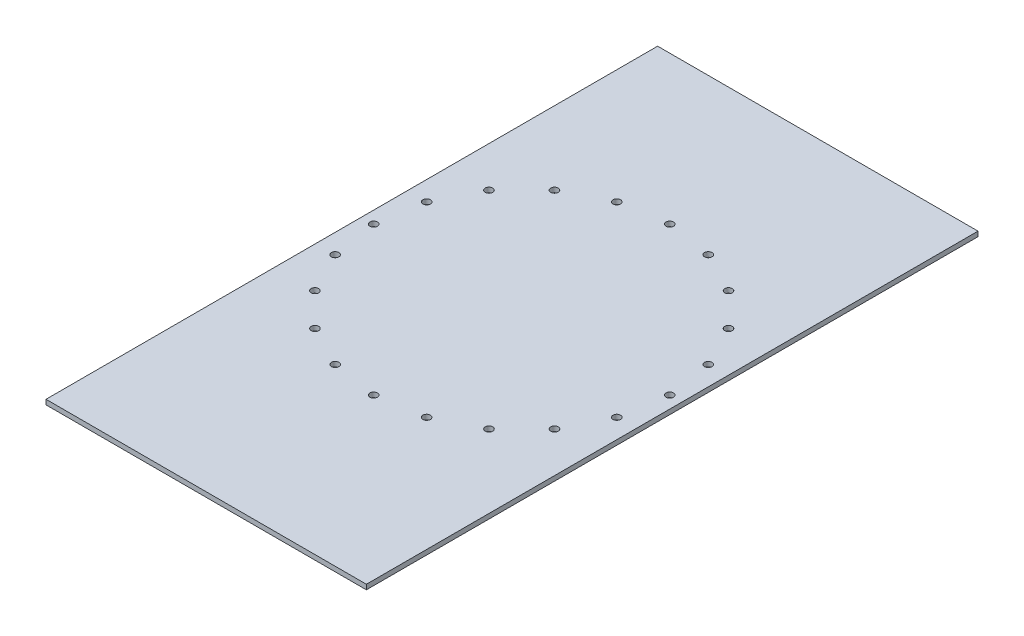
ISO-10303-21;
HEADER;
FILE_DESCRIPTION(('STEP AP214'),'2;1');
FILE_NAME('part.step','',(''),(''),'','','');
FILE_SCHEMA(('AUTOMOTIVE_DESIGN { 1 0 10303 214 1 1 1 1 }'));
ENDSEC;
DATA;
#1=APPLICATION_CONTEXT('core data for automotive mechanical design processes');
#2=APPLICATION_PROTOCOL_DEFINITION('international standard','automotive_design',2000,#1);
#3=PRODUCT_CONTEXT('',#1,'mechanical');
#4=PRODUCT('Part','Part','',(#3));
#5=PRODUCT_RELATED_PRODUCT_CATEGORY('part','',(#4));
#6=PRODUCT_DEFINITION_FORMATION('','',#4);
#7=PRODUCT_DEFINITION_CONTEXT('part definition',#1,'design');
#8=PRODUCT_DEFINITION('design','',#6,#7);
#9=PRODUCT_DEFINITION_SHAPE('','',#8);
#10=(LENGTH_UNIT() NAMED_UNIT(*) SI_UNIT(.MILLI.,.METRE.));
#11=(NAMED_UNIT(*) PLANE_ANGLE_UNIT() SI_UNIT($,.RADIAN.));
#12=(NAMED_UNIT(*) SI_UNIT($,.STERADIAN.) SOLID_ANGLE_UNIT());
#13=UNCERTAINTY_MEASURE_WITH_UNIT(LENGTH_MEASURE(1.E-05),#10,'distance_accuracy_value','');
#14=(GEOMETRIC_REPRESENTATION_CONTEXT(3) GLOBAL_UNCERTAINTY_ASSIGNED_CONTEXT((#13)) GLOBAL_UNIT_ASSIGNED_CONTEXT((#10,
#11,#12)) REPRESENTATION_CONTEXT('',''));
#15=CARTESIAN_POINT('',(0.,0.,0.));
#16=DIRECTION('',(0.,0.,1.));
#17=DIRECTION('',(1.,0.,0.));
#18=AXIS2_PLACEMENT_3D('',#15,#16,#17);
#19=CARTESIAN_POINT('',(0.,10.,0.));
#20=DIRECTION('',(1.,0.,0.));
#21=DIRECTION('',(0.,0.,-1.));
#22=AXIS2_PLACEMENT_3D('',#19,#20,#21);
#23=PLANE('',#22);
#24=DIRECTION('',(0.,0.,1.));
#25=VECTOR('',#24,1.);
#26=CARTESIAN_POINT('',(0.,0.,0.));
#27=LINE('',#26,#25);
#28=CARTESIAN_POINT('',(0.,0.,-1260.));
#29=VERTEX_POINT('',#28);
#30=CARTESIAN_POINT('',(0.,0.,0.));
#31=VERTEX_POINT('',#30);
#32=EDGE_CURVE('E96',#29,#31,#27,.T.);
#33=ORIENTED_EDGE('',*,*,#32,.T.);
#34=DIRECTION('',(0.,-1.,0.));
#35=VECTOR('',#34,1.);
#36=CARTESIAN_POINT('',(0.,10.,0.));
#37=LINE('',#36,#35);
#38=CARTESIAN_POINT('',(0.,10.,0.));
#39=VERTEX_POINT('',#38);
#40=EDGE_CURVE('E11',#39,#31,#37,.T.);
#41=ORIENTED_EDGE('',*,*,#40,.F.);
#42=DIRECTION('',(0.,0.,1.));
#43=VECTOR('',#42,1.);
#44=CARTESIAN_POINT('',(0.,10.,0.));
#45=LINE('',#44,#43);
#46=CARTESIAN_POINT('',(0.,10.,-1260.));
#47=VERTEX_POINT('',#46);
#48=EDGE_CURVE('E84',#47,#39,#45,.T.);
#49=ORIENTED_EDGE('',*,*,#48,.F.);
#50=DIRECTION('',(0.,-1.,0.));
#51=VECTOR('',#50,1.);
#52=CARTESIAN_POINT('',(0.,10.,-1260.));
#53=LINE('',#52,#51);
#54=EDGE_CURVE('E92',#47,#29,#53,.T.);
#55=ORIENTED_EDGE('',*,*,#54,.T.);
#56=EDGE_LOOP('',(#33,#41,#49,#55));
#57=FACE_BOUND('',#56,.T.);
#58=ADVANCED_FACE('F33',(#57),#23,.F.);
#59=CARTESIAN_POINT('',(0.,10.,0.));
#60=DIRECTION('',(0.,0.,-1.));
#61=DIRECTION('',(-1.,0.,0.));
#62=AXIS2_PLACEMENT_3D('',#59,#60,#61);
#63=PLANE('',#62);
#64=DIRECTION('',(1.,0.,0.));
#65=VECTOR('',#64,1.);
#66=CARTESIAN_POINT('',(0.,0.,0.));
#67=LINE('',#66,#65);
#68=CARTESIAN_POINT('',(660.,0.,0.));
#69=VERTEX_POINT('',#68);
#70=EDGE_CURVE('E88',#31,#69,#67,.T.);
#71=ORIENTED_EDGE('',*,*,#70,.T.);
#72=DIRECTION('',(0.,-1.,0.));
#73=VECTOR('',#72,1.);
#74=CARTESIAN_POINT('',(660.,10.,0.));
#75=LINE('',#74,#73);
#76=CARTESIAN_POINT('',(660.,10.,0.));
#77=VERTEX_POINT('',#76);
#78=EDGE_CURVE('E41',#77,#69,#75,.T.);
#79=ORIENTED_EDGE('',*,*,#78,.F.);
#80=DIRECTION('',(1.,0.,0.));
#81=VECTOR('',#80,1.);
#82=CARTESIAN_POINT('',(0.,10.,0.));
#83=LINE('',#82,#81);
#84=EDGE_CURVE('E79',#39,#77,#83,.T.);
#85=ORIENTED_EDGE('',*,*,#84,.F.);
#86=ORIENTED_EDGE('',*,*,#40,.T.);
#87=EDGE_LOOP('',(#71,#79,#85,#86));
#88=FACE_BOUND('',#87,.T.);
#89=ADVANCED_FACE('F87',(#88),#63,.F.);
#90=CARTESIAN_POINT('',(660.,10.,0.));
#91=DIRECTION('',(-1.,0.,0.));
#92=DIRECTION('',(0.,0.,1.));
#93=AXIS2_PLACEMENT_3D('',#90,#91,#92);
#94=PLANE('',#93);
#95=DIRECTION('',(0.,0.,-1.));
#96=VECTOR('',#95,1.);
#97=CARTESIAN_POINT('',(660.,0.,0.));
#98=LINE('',#97,#96);
#99=CARTESIAN_POINT('',(660.,0.,-1260.));
#100=VERTEX_POINT('',#99);
#101=EDGE_CURVE('E66',#69,#100,#98,.T.);
#102=ORIENTED_EDGE('',*,*,#101,.T.);
#103=DIRECTION('',(0.,-1.,0.));
#104=VECTOR('',#103,1.);
#105=CARTESIAN_POINT('',(660.,10.,-1260.));
#106=LINE('',#105,#104);
#107=CARTESIAN_POINT('',(660.,10.,-1260.));
#108=VERTEX_POINT('',#107);
#109=EDGE_CURVE('E89',#108,#100,#106,.T.);
#110=ORIENTED_EDGE('',*,*,#109,.F.);
#111=DIRECTION('',(0.,0.,-1.));
#112=VECTOR('',#111,1.);
#113=CARTESIAN_POINT('',(660.,10.,0.));
#114=LINE('',#113,#112);
#115=EDGE_CURVE('E82',#77,#108,#114,.T.);
#116=ORIENTED_EDGE('',*,*,#115,.F.);
#117=ORIENTED_EDGE('',*,*,#78,.T.);
#118=EDGE_LOOP('',(#102,#110,#116,#117));
#119=FACE_BOUND('',#118,.T.);
#120=ADVANCED_FACE('F90',(#119),#94,.F.);
#121=CARTESIAN_POINT('',(0.,10.,-1260.));
#122=DIRECTION('',(0.,0.,1.));
#123=DIRECTION('',(1.,0.,0.));
#124=AXIS2_PLACEMENT_3D('',#121,#122,#123);
#125=PLANE('',#124);
#126=DIRECTION('',(-1.,0.,0.));
#127=VECTOR('',#126,1.);
#128=CARTESIAN_POINT('',(0.,0.,-1260.));
#129=LINE('',#128,#127);
#130=EDGE_CURVE('E72',#100,#29,#129,.T.);
#131=ORIENTED_EDGE('',*,*,#130,.T.);
#132=ORIENTED_EDGE('',*,*,#54,.F.);
#133=DIRECTION('',(-1.,0.,0.));
#134=VECTOR('',#133,1.);
#135=CARTESIAN_POINT('',(0.,10.,-1260.));
#136=LINE('',#135,#134);
#137=EDGE_CURVE('E49',#108,#47,#136,.T.);
#138=ORIENTED_EDGE('',*,*,#137,.F.);
#139=ORIENTED_EDGE('',*,*,#109,.T.);
#140=EDGE_LOOP('',(#131,#132,#138,#139));
#141=FACE_BOUND('',#140,.T.);
#142=ADVANCED_FACE('F104',(#141),#125,.F.);
#143=CARTESIAN_POINT('',(0.,10.,0.));
#144=DIRECTION('',(0.,-1.,0.));
#145=DIRECTION('',(0.,0.,-1.));
#146=AXIS2_PLACEMENT_3D('',#143,#144,#145);
#147=PLANE('',#146);
#148=CARTESIAN_POINT('',(39.9277625299783,10.,-555.749816715641));
#149=DIRECTION('',(0.,1.,0.));
#150=DIRECTION('',(0.,0.,1.));
#151=AXIS2_PLACEMENT_3D('',#148,#149,#150);
#152=CIRCLE('',#151,7.74999999999992);
#153=CARTESIAN_POINT('',(39.9277625299783,10.,-547.999816715641));
#154=VERTEX_POINT('',#153);
#155=EDGE_CURVE('E224',#154,#154,#152,.T.);
#156=ORIENTED_EDGE('',*,*,#155,.F.);
#157=EDGE_LOOP('',(#156));
#158=FACE_BOUND('',#157,.T.);
#159=CARTESIAN_POINT('',(83.2498167156411,10.,-470.725498050796));
#160=DIRECTION('',(0.,1.,0.));
#161=DIRECTION('',(0.,0.,1.));
#162=AXIS2_PLACEMENT_3D('',#159,#160,#161);
#163=CIRCLE('',#162,7.75);
#164=CARTESIAN_POINT('',(83.2498167156411,10.,-462.975498050796));
#165=VERTEX_POINT('',#164);
#166=EDGE_CURVE('E218',#165,#165,#163,.T.);
#167=ORIENTED_EDGE('',*,*,#166,.F.);
#168=EDGE_LOOP('',(#167));
#169=FACE_BOUND('',#168,.T.);
#170=CARTESIAN_POINT('',(150.725498050796,10.,-403.249816715641));
#171=DIRECTION('',(0.,1.,0.));
#172=DIRECTION('',(0.,0.,1.));
#173=AXIS2_PLACEMENT_3D('',#170,#171,#172);
#174=CIRCLE('',#173,7.75000000000005);
#175=CARTESIAN_POINT('',(150.725498050796,10.,-395.499816715641));
#176=VERTEX_POINT('',#175);
#177=EDGE_CURVE('E212',#176,#176,#174,.T.);
#178=ORIENTED_EDGE('',*,*,#177,.F.);
#179=EDGE_LOOP('',(#178));
#180=FACE_BOUND('',#179,.T.);
#181=CARTESIAN_POINT('',(235.749816715641,10.,-359.927762529978));
#182=DIRECTION('',(0.,1.,0.));
#183=DIRECTION('',(0.,0.,1.));
#184=AXIS2_PLACEMENT_3D('',#181,#182,#183);
#185=CIRCLE('',#184,7.74999999999997);
#186=CARTESIAN_POINT('',(235.749816715641,10.,-352.177762529978));
#187=VERTEX_POINT('',#186);
#188=EDGE_CURVE('E206',#187,#187,#185,.T.);
#189=ORIENTED_EDGE('',*,*,#188,.F.);
#190=EDGE_LOOP('',(#189));
#191=FACE_BOUND('',#190,.T.);
#192=CARTESIAN_POINT('',(330.,10.,-345.));
#193=DIRECTION('',(0.,1.,0.));
#194=DIRECTION('',(0.,0.,1.));
#195=AXIS2_PLACEMENT_3D('',#192,#193,#194);
#196=CIRCLE('',#195,7.74999999999997);
#197=CARTESIAN_POINT('',(330.,10.,-337.25));
#198=VERTEX_POINT('',#197);
#199=EDGE_CURVE('E200',#198,#198,#196,.T.);
#200=ORIENTED_EDGE('',*,*,#199,.F.);
#201=EDGE_LOOP('',(#200));
#202=FACE_BOUND('',#201,.T.);
#203=CARTESIAN_POINT('',(424.250183284359,10.,-359.927762529978));
#204=DIRECTION('',(0.,1.,0.));
#205=DIRECTION('',(0.,0.,1.));
#206=AXIS2_PLACEMENT_3D('',#203,#204,#205);
#207=CIRCLE('',#206,7.74999999999997);
#208=CARTESIAN_POINT('',(424.250183284359,10.,-352.177762529978));
#209=VERTEX_POINT('',#208);
#210=EDGE_CURVE('E194',#209,#209,#207,.T.);
#211=ORIENTED_EDGE('',*,*,#210,.F.);
#212=EDGE_LOOP('',(#211));
#213=FACE_BOUND('',#212,.T.);
#214=CARTESIAN_POINT('',(509.274501949204,10.,-403.249816715641));
#215=DIRECTION('',(0.,1.,0.));
#216=DIRECTION('',(0.,0.,1.));
#217=AXIS2_PLACEMENT_3D('',#214,#215,#216);
#218=CIRCLE('',#217,7.74999999999996);
#219=CARTESIAN_POINT('',(509.274501949204,10.,-395.499816715641));
#220=VERTEX_POINT('',#219);
#221=EDGE_CURVE('E188',#220,#220,#218,.T.);
#222=ORIENTED_EDGE('',*,*,#221,.F.);
#223=EDGE_LOOP('',(#222));
#224=FACE_BOUND('',#223,.T.);
#225=CARTESIAN_POINT('',(576.750183284359,10.,-470.725498050795));
#226=DIRECTION('',(0.,1.,0.));
#227=DIRECTION('',(0.,0.,1.));
#228=AXIS2_PLACEMENT_3D('',#225,#226,#227);
#229=CIRCLE('',#228,7.74999999999996);
#230=CARTESIAN_POINT('',(576.750183284359,10.,-462.975498050795));
#231=VERTEX_POINT('',#230);
#232=EDGE_CURVE('E182',#231,#231,#229,.T.);
#233=ORIENTED_EDGE('',*,*,#232,.F.);
#234=EDGE_LOOP('',(#233));
#235=FACE_BOUND('',#234,.T.);
#236=CARTESIAN_POINT('',(620.072237470022,10.,-555.749816715641));
#237=DIRECTION('',(0.,1.,0.));
#238=DIRECTION('',(0.,0.,1.));
#239=AXIS2_PLACEMENT_3D('',#236,#237,#238);
#240=CIRCLE('',#239,7.74999999999996);
#241=CARTESIAN_POINT('',(620.072237470022,10.,-547.999816715641));
#242=VERTEX_POINT('',#241);
#243=EDGE_CURVE('E176',#242,#242,#240,.T.);
#244=ORIENTED_EDGE('',*,*,#243,.F.);
#245=EDGE_LOOP('',(#244));
#246=FACE_BOUND('',#245,.T.);
#247=CARTESIAN_POINT('',(635.,10.,-650.));
#248=DIRECTION('',(0.,1.,0.));
#249=DIRECTION('',(0.,0.,1.));
#250=AXIS2_PLACEMENT_3D('',#247,#248,#249);
#251=CIRCLE('',#250,7.74999999999996);
#252=CARTESIAN_POINT('',(635.,10.,-642.25));
#253=VERTEX_POINT('',#252);
#254=EDGE_CURVE('E170',#253,#253,#251,.T.);
#255=ORIENTED_EDGE('',*,*,#254,.F.);
#256=EDGE_LOOP('',(#255));
#257=FACE_BOUND('',#256,.T.);
#258=CARTESIAN_POINT('',(620.072237470022,10.,-744.250183284359));
#259=DIRECTION('',(0.,1.,0.));
#260=DIRECTION('',(0.,0.,1.));
#261=AXIS2_PLACEMENT_3D('',#258,#259,#260);
#262=CIRCLE('',#261,7.74999999999996);
#263=CARTESIAN_POINT('',(620.072237470022,10.,-736.500183284359));
#264=VERTEX_POINT('',#263);
#265=EDGE_CURVE('E164',#264,#264,#262,.T.);
#266=ORIENTED_EDGE('',*,*,#265,.F.);
#267=EDGE_LOOP('',(#266));
#268=FACE_BOUND('',#267,.T.);
#269=CARTESIAN_POINT('',(576.750183284359,10.,-829.274501949204));
#270=DIRECTION('',(0.,1.,0.));
#271=DIRECTION('',(0.,0.,1.));
#272=AXIS2_PLACEMENT_3D('',#269,#270,#271);
#273=CIRCLE('',#272,7.7500000000002);
#274=CARTESIAN_POINT('',(576.750183284359,10.,-821.524501949204));
#275=VERTEX_POINT('',#274);
#276=EDGE_CURVE('E158',#275,#275,#273,.T.);
#277=ORIENTED_EDGE('',*,*,#276,.F.);
#278=EDGE_LOOP('',(#277));
#279=FACE_BOUND('',#278,.T.);
#280=CARTESIAN_POINT('',(509.274501949205,10.,-896.750183284359));
#281=DIRECTION('',(0.,1.,0.));
#282=DIRECTION('',(0.,0.,1.));
#283=AXIS2_PLACEMENT_3D('',#280,#281,#282);
#284=CIRCLE('',#283,7.74999999999996);
#285=CARTESIAN_POINT('',(509.274501949205,10.,-889.000183284359));
#286=VERTEX_POINT('',#285);
#287=EDGE_CURVE('E152',#286,#286,#284,.T.);
#288=ORIENTED_EDGE('',*,*,#287,.F.);
#289=EDGE_LOOP('',(#288));
#290=FACE_BOUND('',#289,.T.);
#291=CARTESIAN_POINT('',(424.250183284359,10.,-940.072237470022));
#292=DIRECTION('',(0.,1.,0.));
#293=DIRECTION('',(0.,0.,1.));
#294=AXIS2_PLACEMENT_3D('',#291,#292,#293);
#295=CIRCLE('',#294,7.74999999999996);
#296=CARTESIAN_POINT('',(424.250183284359,10.,-932.322237470022));
#297=VERTEX_POINT('',#296);
#298=EDGE_CURVE('E146',#297,#297,#295,.T.);
#299=ORIENTED_EDGE('',*,*,#298,.F.);
#300=EDGE_LOOP('',(#299));
#301=FACE_BOUND('',#300,.T.);
#302=CARTESIAN_POINT('',(330.,10.,-955.));
#303=DIRECTION('',(0.,1.,0.));
#304=DIRECTION('',(0.,0.,1.));
#305=AXIS2_PLACEMENT_3D('',#302,#303,#304);
#306=CIRCLE('',#305,7.74999999999996);
#307=CARTESIAN_POINT('',(330.,10.,-947.25));
#308=VERTEX_POINT('',#307);
#309=EDGE_CURVE('E140',#308,#308,#306,.T.);
#310=ORIENTED_EDGE('',*,*,#309,.F.);
#311=EDGE_LOOP('',(#310));
#312=FACE_BOUND('',#311,.T.);
#313=CARTESIAN_POINT('',(235.749816715641,10.,-940.072237470022));
#314=DIRECTION('',(0.,1.,0.));
#315=DIRECTION('',(0.,0.,1.));
#316=AXIS2_PLACEMENT_3D('',#313,#314,#315);
#317=CIRCLE('',#316,7.74999999999985);
#318=CARTESIAN_POINT('',(235.749816715641,10.,-932.322237470022));
#319=VERTEX_POINT('',#318);
#320=EDGE_CURVE('E134',#319,#319,#317,.T.);
#321=ORIENTED_EDGE('',*,*,#320,.F.);
#322=EDGE_LOOP('',(#321));
#323=FACE_BOUND('',#322,.T.);
#324=CARTESIAN_POINT('',(150.725498050796,10.,-896.750183284359));
#325=DIRECTION('',(0.,1.,0.));
#326=DIRECTION('',(0.,0.,1.));
#327=AXIS2_PLACEMENT_3D('',#324,#325,#326);
#328=CIRCLE('',#327,7.74999999999985);
#329=CARTESIAN_POINT('',(150.725498050796,10.,-889.000183284359));
#330=VERTEX_POINT('',#329);
#331=EDGE_CURVE('E128',#330,#330,#328,.T.);
#332=ORIENTED_EDGE('',*,*,#331,.F.);
#333=EDGE_LOOP('',(#332));
#334=FACE_BOUND('',#333,.T.);
#335=CARTESIAN_POINT('',(83.2498167156411,10.,-829.274501949204));
#336=DIRECTION('',(0.,1.,0.));
#337=DIRECTION('',(0.,0.,1.));
#338=AXIS2_PLACEMENT_3D('',#335,#336,#337);
#339=CIRCLE('',#338,7.74999999999994);
#340=CARTESIAN_POINT('',(83.2498167156411,10.,-821.524501949204));
#341=VERTEX_POINT('',#340);
#342=EDGE_CURVE('E122',#341,#341,#339,.T.);
#343=ORIENTED_EDGE('',*,*,#342,.F.);
#344=EDGE_LOOP('',(#343));
#345=FACE_BOUND('',#344,.T.);
#346=CARTESIAN_POINT('',(39.9277625299782,10.,-744.250183284359));
#347=DIRECTION('',(0.,1.,0.));
#348=DIRECTION('',(0.,0.,1.));
#349=AXIS2_PLACEMENT_3D('',#346,#347,#348);
#350=CIRCLE('',#349,7.74999999999993);
#351=CARTESIAN_POINT('',(39.9277625299782,10.,-736.500183284359));
#352=VERTEX_POINT('',#351);
#353=EDGE_CURVE('E116',#352,#352,#350,.T.);
#354=ORIENTED_EDGE('',*,*,#353,.F.);
#355=EDGE_LOOP('',(#354));
#356=FACE_BOUND('',#355,.T.);
#357=CARTESIAN_POINT('',(25.0000000000001,10.,-650.));
#358=DIRECTION('',(0.,1.,0.));
#359=DIRECTION('',(0.,0.,1.));
#360=AXIS2_PLACEMENT_3D('',#357,#358,#359);
#361=CIRCLE('',#360,7.74999999999994);
#362=CARTESIAN_POINT('',(25.0000000000001,10.,-642.25));
#363=VERTEX_POINT('',#362);
#364=EDGE_CURVE('E110',#363,#363,#361,.T.);
#365=ORIENTED_EDGE('',*,*,#364,.F.);
#366=EDGE_LOOP('',(#365));
#367=FACE_BOUND('',#366,.T.);
#368=ORIENTED_EDGE('',*,*,#48,.T.);
#369=ORIENTED_EDGE('',*,*,#84,.T.);
#370=ORIENTED_EDGE('',*,*,#115,.T.);
#371=ORIENTED_EDGE('',*,*,#137,.T.);
#372=EDGE_LOOP('',(#368,#369,#370,#371));
#373=FACE_BOUND('',#372,.T.);
#374=ADVANCED_FACE('F80',(#158,#169,#180,#191,#202,#213,#224,#235,#246,#257,#268,#279,#290,#301,
#312,#323,#334,#345,#356,#367,#373),#147,.F.);
#375=CARTESIAN_POINT('',(0.,0.,0.));
#376=DIRECTION('',(0.,-1.,0.));
#377=DIRECTION('',(0.,0.,-1.));
#378=AXIS2_PLACEMENT_3D('',#375,#376,#377);
#379=PLANE('',#378);
#380=CARTESIAN_POINT('',(39.9277625299783,0.,-555.749816715641));
#381=DIRECTION('',(0.,1.,0.));
#382=DIRECTION('',(0.,0.,1.));
#383=AXIS2_PLACEMENT_3D('',#380,#381,#382);
#384=CIRCLE('',#383,7.74999999999992);
#385=CARTESIAN_POINT('',(39.9277625299783,0.,-547.999816715641));
#386=VERTEX_POINT('',#385);
#387=EDGE_CURVE('E221',#386,#386,#384,.T.);
#388=ORIENTED_EDGE('',*,*,#387,.T.);
#389=EDGE_LOOP('',(#388));
#390=FACE_BOUND('',#389,.T.);
#391=CARTESIAN_POINT('',(83.2498167156411,0.,-470.725498050796));
#392=DIRECTION('',(0.,1.,0.));
#393=DIRECTION('',(0.,0.,1.));
#394=AXIS2_PLACEMENT_3D('',#391,#392,#393);
#395=CIRCLE('',#394,7.75);
#396=CARTESIAN_POINT('',(83.2498167156411,0.,-462.975498050796));
#397=VERTEX_POINT('',#396);
#398=EDGE_CURVE('E215',#397,#397,#395,.T.);
#399=ORIENTED_EDGE('',*,*,#398,.T.);
#400=EDGE_LOOP('',(#399));
#401=FACE_BOUND('',#400,.T.);
#402=CARTESIAN_POINT('',(150.725498050796,0.,-403.249816715641));
#403=DIRECTION('',(0.,1.,0.));
#404=DIRECTION('',(0.,0.,1.));
#405=AXIS2_PLACEMENT_3D('',#402,#403,#404);
#406=CIRCLE('',#405,7.75000000000005);
#407=CARTESIAN_POINT('',(150.725498050796,0.,-395.499816715641));
#408=VERTEX_POINT('',#407);
#409=EDGE_CURVE('E209',#408,#408,#406,.T.);
#410=ORIENTED_EDGE('',*,*,#409,.T.);
#411=EDGE_LOOP('',(#410));
#412=FACE_BOUND('',#411,.T.);
#413=CARTESIAN_POINT('',(235.749816715641,0.,-359.927762529978));
#414=DIRECTION('',(0.,1.,0.));
#415=DIRECTION('',(0.,0.,1.));
#416=AXIS2_PLACEMENT_3D('',#413,#414,#415);
#417=CIRCLE('',#416,7.74999999999997);
#418=CARTESIAN_POINT('',(235.749816715641,0.,-352.177762529978));
#419=VERTEX_POINT('',#418);
#420=EDGE_CURVE('E203',#419,#419,#417,.T.);
#421=ORIENTED_EDGE('',*,*,#420,.T.);
#422=EDGE_LOOP('',(#421));
#423=FACE_BOUND('',#422,.T.);
#424=CARTESIAN_POINT('',(330.,0.,-345.));
#425=DIRECTION('',(0.,1.,0.));
#426=DIRECTION('',(0.,0.,1.));
#427=AXIS2_PLACEMENT_3D('',#424,#425,#426);
#428=CIRCLE('',#427,7.74999999999997);
#429=CARTESIAN_POINT('',(330.,0.,-337.25));
#430=VERTEX_POINT('',#429);
#431=EDGE_CURVE('E197',#430,#430,#428,.T.);
#432=ORIENTED_EDGE('',*,*,#431,.T.);
#433=EDGE_LOOP('',(#432));
#434=FACE_BOUND('',#433,.T.);
#435=CARTESIAN_POINT('',(424.250183284359,0.,-359.927762529978));
#436=DIRECTION('',(0.,1.,0.));
#437=DIRECTION('',(0.,0.,1.));
#438=AXIS2_PLACEMENT_3D('',#435,#436,#437);
#439=CIRCLE('',#438,7.74999999999997);
#440=CARTESIAN_POINT('',(424.250183284359,0.,-352.177762529978));
#441=VERTEX_POINT('',#440);
#442=EDGE_CURVE('E191',#441,#441,#439,.T.);
#443=ORIENTED_EDGE('',*,*,#442,.T.);
#444=EDGE_LOOP('',(#443));
#445=FACE_BOUND('',#444,.T.);
#446=CARTESIAN_POINT('',(509.274501949204,0.,-403.249816715641));
#447=DIRECTION('',(0.,1.,0.));
#448=DIRECTION('',(0.,0.,1.));
#449=AXIS2_PLACEMENT_3D('',#446,#447,#448);
#450=CIRCLE('',#449,7.74999999999996);
#451=CARTESIAN_POINT('',(509.274501949204,0.,-395.499816715641));
#452=VERTEX_POINT('',#451);
#453=EDGE_CURVE('E185',#452,#452,#450,.T.);
#454=ORIENTED_EDGE('',*,*,#453,.T.);
#455=EDGE_LOOP('',(#454));
#456=FACE_BOUND('',#455,.T.);
#457=CARTESIAN_POINT('',(576.750183284359,0.,-470.725498050795));
#458=DIRECTION('',(0.,1.,0.));
#459=DIRECTION('',(0.,0.,1.));
#460=AXIS2_PLACEMENT_3D('',#457,#458,#459);
#461=CIRCLE('',#460,7.74999999999996);
#462=CARTESIAN_POINT('',(576.750183284359,0.,-462.975498050795));
#463=VERTEX_POINT('',#462);
#464=EDGE_CURVE('E179',#463,#463,#461,.T.);
#465=ORIENTED_EDGE('',*,*,#464,.T.);
#466=EDGE_LOOP('',(#465));
#467=FACE_BOUND('',#466,.T.);
#468=CARTESIAN_POINT('',(620.072237470022,0.,-555.749816715641));
#469=DIRECTION('',(0.,1.,0.));
#470=DIRECTION('',(0.,0.,1.));
#471=AXIS2_PLACEMENT_3D('',#468,#469,#470);
#472=CIRCLE('',#471,7.74999999999996);
#473=CARTESIAN_POINT('',(620.072237470022,0.,-547.999816715641));
#474=VERTEX_POINT('',#473);
#475=EDGE_CURVE('E173',#474,#474,#472,.T.);
#476=ORIENTED_EDGE('',*,*,#475,.T.);
#477=EDGE_LOOP('',(#476));
#478=FACE_BOUND('',#477,.T.);
#479=CARTESIAN_POINT('',(635.,0.,-650.));
#480=DIRECTION('',(0.,1.,0.));
#481=DIRECTION('',(0.,0.,1.));
#482=AXIS2_PLACEMENT_3D('',#479,#480,#481);
#483=CIRCLE('',#482,7.74999999999996);
#484=CARTESIAN_POINT('',(635.,0.,-642.25));
#485=VERTEX_POINT('',#484);
#486=EDGE_CURVE('E167',#485,#485,#483,.T.);
#487=ORIENTED_EDGE('',*,*,#486,.T.);
#488=EDGE_LOOP('',(#487));
#489=FACE_BOUND('',#488,.T.);
#490=CARTESIAN_POINT('',(620.072237470022,0.,-744.250183284359));
#491=DIRECTION('',(0.,1.,0.));
#492=DIRECTION('',(0.,0.,1.));
#493=AXIS2_PLACEMENT_3D('',#490,#491,#492);
#494=CIRCLE('',#493,7.74999999999996);
#495=CARTESIAN_POINT('',(620.072237470022,0.,-736.500183284359));
#496=VERTEX_POINT('',#495);
#497=EDGE_CURVE('E161',#496,#496,#494,.T.);
#498=ORIENTED_EDGE('',*,*,#497,.T.);
#499=EDGE_LOOP('',(#498));
#500=FACE_BOUND('',#499,.T.);
#501=CARTESIAN_POINT('',(576.750183284359,0.,-829.274501949204));
#502=DIRECTION('',(0.,1.,0.));
#503=DIRECTION('',(0.,0.,1.));
#504=AXIS2_PLACEMENT_3D('',#501,#502,#503);
#505=CIRCLE('',#504,7.7500000000002);
#506=CARTESIAN_POINT('',(576.750183284359,0.,-821.524501949204));
#507=VERTEX_POINT('',#506);
#508=EDGE_CURVE('E155',#507,#507,#505,.T.);
#509=ORIENTED_EDGE('',*,*,#508,.T.);
#510=EDGE_LOOP('',(#509));
#511=FACE_BOUND('',#510,.T.);
#512=CARTESIAN_POINT('',(509.274501949205,0.,-896.750183284359));
#513=DIRECTION('',(0.,1.,0.));
#514=DIRECTION('',(0.,0.,1.));
#515=AXIS2_PLACEMENT_3D('',#512,#513,#514);
#516=CIRCLE('',#515,7.74999999999996);
#517=CARTESIAN_POINT('',(509.274501949205,0.,-889.000183284359));
#518=VERTEX_POINT('',#517);
#519=EDGE_CURVE('E149',#518,#518,#516,.T.);
#520=ORIENTED_EDGE('',*,*,#519,.T.);
#521=EDGE_LOOP('',(#520));
#522=FACE_BOUND('',#521,.T.);
#523=CARTESIAN_POINT('',(424.250183284359,0.,-940.072237470022));
#524=DIRECTION('',(0.,1.,0.));
#525=DIRECTION('',(0.,0.,1.));
#526=AXIS2_PLACEMENT_3D('',#523,#524,#525);
#527=CIRCLE('',#526,7.74999999999996);
#528=CARTESIAN_POINT('',(424.250183284359,0.,-932.322237470022));
#529=VERTEX_POINT('',#528);
#530=EDGE_CURVE('E143',#529,#529,#527,.T.);
#531=ORIENTED_EDGE('',*,*,#530,.T.);
#532=EDGE_LOOP('',(#531));
#533=FACE_BOUND('',#532,.T.);
#534=CARTESIAN_POINT('',(330.,0.,-955.));
#535=DIRECTION('',(0.,1.,0.));
#536=DIRECTION('',(0.,0.,1.));
#537=AXIS2_PLACEMENT_3D('',#534,#535,#536);
#538=CIRCLE('',#537,7.74999999999996);
#539=CARTESIAN_POINT('',(330.,0.,-947.25));
#540=VERTEX_POINT('',#539);
#541=EDGE_CURVE('E137',#540,#540,#538,.T.);
#542=ORIENTED_EDGE('',*,*,#541,.T.);
#543=EDGE_LOOP('',(#542));
#544=FACE_BOUND('',#543,.T.);
#545=CARTESIAN_POINT('',(235.749816715641,0.,-940.072237470022));
#546=DIRECTION('',(0.,1.,0.));
#547=DIRECTION('',(0.,0.,1.));
#548=AXIS2_PLACEMENT_3D('',#545,#546,#547);
#549=CIRCLE('',#548,7.74999999999985);
#550=CARTESIAN_POINT('',(235.749816715641,0.,-932.322237470022));
#551=VERTEX_POINT('',#550);
#552=EDGE_CURVE('E131',#551,#551,#549,.T.);
#553=ORIENTED_EDGE('',*,*,#552,.T.);
#554=EDGE_LOOP('',(#553));
#555=FACE_BOUND('',#554,.T.);
#556=CARTESIAN_POINT('',(150.725498050796,0.,-896.750183284359));
#557=DIRECTION('',(0.,1.,0.));
#558=DIRECTION('',(0.,0.,1.));
#559=AXIS2_PLACEMENT_3D('',#556,#557,#558);
#560=CIRCLE('',#559,7.74999999999985);
#561=CARTESIAN_POINT('',(150.725498050796,0.,-889.000183284359));
#562=VERTEX_POINT('',#561);
#563=EDGE_CURVE('E125',#562,#562,#560,.T.);
#564=ORIENTED_EDGE('',*,*,#563,.T.);
#565=EDGE_LOOP('',(#564));
#566=FACE_BOUND('',#565,.T.);
#567=CARTESIAN_POINT('',(83.2498167156411,0.,-829.274501949204));
#568=DIRECTION('',(0.,1.,0.));
#569=DIRECTION('',(0.,0.,1.));
#570=AXIS2_PLACEMENT_3D('',#567,#568,#569);
#571=CIRCLE('',#570,7.74999999999994);
#572=CARTESIAN_POINT('',(83.2498167156411,0.,-821.524501949204));
#573=VERTEX_POINT('',#572);
#574=EDGE_CURVE('E119',#573,#573,#571,.T.);
#575=ORIENTED_EDGE('',*,*,#574,.T.);
#576=EDGE_LOOP('',(#575));
#577=FACE_BOUND('',#576,.T.);
#578=CARTESIAN_POINT('',(39.9277625299782,0.,-744.250183284359));
#579=DIRECTION('',(0.,1.,0.));
#580=DIRECTION('',(0.,0.,1.));
#581=AXIS2_PLACEMENT_3D('',#578,#579,#580);
#582=CIRCLE('',#581,7.74999999999993);
#583=CARTESIAN_POINT('',(39.9277625299782,0.,-736.500183284359));
#584=VERTEX_POINT('',#583);
#585=EDGE_CURVE('E113',#584,#584,#582,.T.);
#586=ORIENTED_EDGE('',*,*,#585,.T.);
#587=EDGE_LOOP('',(#586));
#588=FACE_BOUND('',#587,.T.);
#589=CARTESIAN_POINT('',(25.0000000000001,0.,-650.));
#590=DIRECTION('',(0.,1.,0.));
#591=DIRECTION('',(0.,0.,1.));
#592=AXIS2_PLACEMENT_3D('',#589,#590,#591);
#593=CIRCLE('',#592,7.74999999999994);
#594=CARTESIAN_POINT('',(25.0000000000001,0.,-642.25));
#595=VERTEX_POINT('',#594);
#596=EDGE_CURVE('E99',#595,#595,#593,.T.);
#597=ORIENTED_EDGE('',*,*,#596,.T.);
#598=EDGE_LOOP('',(#597));
#599=FACE_BOUND('',#598,.T.);
#600=ORIENTED_EDGE('',*,*,#32,.F.);
#601=ORIENTED_EDGE('',*,*,#130,.F.);
#602=ORIENTED_EDGE('',*,*,#101,.F.);
#603=ORIENTED_EDGE('',*,*,#70,.F.);
#604=EDGE_LOOP('',(#600,#601,#602,#603));
#605=FACE_BOUND('',#604,.T.);
#606=ADVANCED_FACE('F107',(#390,#401,#412,#423,#434,#445,#456,#467,#478,#489,#500,#511,#522,
#533,#544,#555,#566,#577,#588,#599,#605),#379,.T.);
#607=CARTESIAN_POINT('',(25.0000000000001,0.,-650.));
#608=DIRECTION('',(0.,1.,0.));
#609=DIRECTION('',(0.,0.,1.));
#610=AXIS2_PLACEMENT_3D('',#607,#608,#609);
#611=CYLINDRICAL_SURFACE('',#610,7.74999999999994);
#612=ORIENTED_EDGE('',*,*,#596,.F.);
#613=EDGE_LOOP('',(#612));
#614=FACE_BOUND('',#613,.T.);
#615=ORIENTED_EDGE('',*,*,#364,.T.);
#616=EDGE_LOOP('',(#615));
#617=FACE_BOUND('',#616,.T.);
#618=ADVANCED_FACE('F280',(#614,#617),#611,.F.);
#619=CARTESIAN_POINT('',(39.9277625299782,0.,-744.250183284359));
#620=DIRECTION('',(0.,1.,0.));
#621=DIRECTION('',(0.,0.,1.));
#622=AXIS2_PLACEMENT_3D('',#619,#620,#621);
#623=CYLINDRICAL_SURFACE('',#622,7.74999999999993);
#624=ORIENTED_EDGE('',*,*,#585,.F.);
#625=EDGE_LOOP('',(#624));
#626=FACE_BOUND('',#625,.T.);
#627=ORIENTED_EDGE('',*,*,#353,.T.);
#628=EDGE_LOOP('',(#627));
#629=FACE_BOUND('',#628,.T.);
#630=ADVANCED_FACE('F282',(#626,#629),#623,.F.);
#631=CARTESIAN_POINT('',(83.2498167156411,0.,-829.274501949204));
#632=DIRECTION('',(0.,1.,0.));
#633=DIRECTION('',(0.,0.,1.));
#634=AXIS2_PLACEMENT_3D('',#631,#632,#633);
#635=CYLINDRICAL_SURFACE('',#634,7.74999999999994);
#636=ORIENTED_EDGE('',*,*,#574,.F.);
#637=EDGE_LOOP('',(#636));
#638=FACE_BOUND('',#637,.T.);
#639=ORIENTED_EDGE('',*,*,#342,.T.);
#640=EDGE_LOOP('',(#639));
#641=FACE_BOUND('',#640,.T.);
#642=ADVANCED_FACE('F289',(#638,#641),#635,.F.);
#643=CARTESIAN_POINT('',(150.725498050796,0.,-896.750183284359));
#644=DIRECTION('',(0.,1.,0.));
#645=DIRECTION('',(0.,0.,1.));
#646=AXIS2_PLACEMENT_3D('',#643,#644,#645);
#647=CYLINDRICAL_SURFACE('',#646,7.74999999999985);
#648=ORIENTED_EDGE('',*,*,#563,.F.);
#649=EDGE_LOOP('',(#648));
#650=FACE_BOUND('',#649,.T.);
#651=ORIENTED_EDGE('',*,*,#331,.T.);
#652=EDGE_LOOP('',(#651));
#653=FACE_BOUND('',#652,.T.);
#654=ADVANCED_FACE('F337',(#650,#653),#647,.F.);
#655=CARTESIAN_POINT('',(235.749816715641,0.,-940.072237470022));
#656=DIRECTION('',(0.,1.,0.));
#657=DIRECTION('',(0.,0.,1.));
#658=AXIS2_PLACEMENT_3D('',#655,#656,#657);
#659=CYLINDRICAL_SURFACE('',#658,7.74999999999985);
#660=ORIENTED_EDGE('',*,*,#552,.F.);
#661=EDGE_LOOP('',(#660));
#662=FACE_BOUND('',#661,.T.);
#663=ORIENTED_EDGE('',*,*,#320,.T.);
#664=EDGE_LOOP('',(#663));
#665=FACE_BOUND('',#664,.T.);
#666=ADVANCED_FACE('F347',(#662,#665),#659,.F.);
#667=CARTESIAN_POINT('',(330.,0.,-955.));
#668=DIRECTION('',(0.,1.,0.));
#669=DIRECTION('',(0.,0.,1.));
#670=AXIS2_PLACEMENT_3D('',#667,#668,#669);
#671=CYLINDRICAL_SURFACE('',#670,7.74999999999996);
#672=ORIENTED_EDGE('',*,*,#541,.F.);
#673=EDGE_LOOP('',(#672));
#674=FACE_BOUND('',#673,.T.);
#675=ORIENTED_EDGE('',*,*,#309,.T.);
#676=EDGE_LOOP('',(#675));
#677=FACE_BOUND('',#676,.T.);
#678=ADVANCED_FACE('F357',(#674,#677),#671,.F.);
#679=CARTESIAN_POINT('',(424.250183284359,0.,-940.072237470022));
#680=DIRECTION('',(0.,1.,0.));
#681=DIRECTION('',(0.,0.,1.));
#682=AXIS2_PLACEMENT_3D('',#679,#680,#681);
#683=CYLINDRICAL_SURFACE('',#682,7.74999999999996);
#684=ORIENTED_EDGE('',*,*,#530,.F.);
#685=EDGE_LOOP('',(#684));
#686=FACE_BOUND('',#685,.T.);
#687=ORIENTED_EDGE('',*,*,#298,.T.);
#688=EDGE_LOOP('',(#687));
#689=FACE_BOUND('',#688,.T.);
#690=ADVANCED_FACE('F367',(#686,#689),#683,.F.);
#691=CARTESIAN_POINT('',(509.274501949205,0.,-896.750183284359));
#692=DIRECTION('',(0.,1.,0.));
#693=DIRECTION('',(0.,0.,1.));
#694=AXIS2_PLACEMENT_3D('',#691,#692,#693);
#695=CYLINDRICAL_SURFACE('',#694,7.74999999999996);
#696=ORIENTED_EDGE('',*,*,#519,.F.);
#697=EDGE_LOOP('',(#696));
#698=FACE_BOUND('',#697,.T.);
#699=ORIENTED_EDGE('',*,*,#287,.T.);
#700=EDGE_LOOP('',(#699));
#701=FACE_BOUND('',#700,.T.);
#702=ADVANCED_FACE('F377',(#698,#701),#695,.F.);
#703=CARTESIAN_POINT('',(576.750183284359,0.,-829.274501949204));
#704=DIRECTION('',(0.,1.,0.));
#705=DIRECTION('',(0.,0.,1.));
#706=AXIS2_PLACEMENT_3D('',#703,#704,#705);
#707=CYLINDRICAL_SURFACE('',#706,7.7500000000002);
#708=ORIENTED_EDGE('',*,*,#508,.F.);
#709=EDGE_LOOP('',(#708));
#710=FACE_BOUND('',#709,.T.);
#711=ORIENTED_EDGE('',*,*,#276,.T.);
#712=EDGE_LOOP('',(#711));
#713=FACE_BOUND('',#712,.T.);
#714=ADVANCED_FACE('F387',(#710,#713),#707,.F.);
#715=CARTESIAN_POINT('',(620.072237470022,0.,-744.250183284359));
#716=DIRECTION('',(0.,1.,0.));
#717=DIRECTION('',(0.,0.,1.));
#718=AXIS2_PLACEMENT_3D('',#715,#716,#717);
#719=CYLINDRICAL_SURFACE('',#718,7.74999999999996);
#720=ORIENTED_EDGE('',*,*,#497,.F.);
#721=EDGE_LOOP('',(#720));
#722=FACE_BOUND('',#721,.T.);
#723=ORIENTED_EDGE('',*,*,#265,.T.);
#724=EDGE_LOOP('',(#723));
#725=FACE_BOUND('',#724,.T.);
#726=ADVANCED_FACE('F397',(#722,#725),#719,.F.);
#727=CARTESIAN_POINT('',(635.,0.,-650.));
#728=DIRECTION('',(0.,1.,0.));
#729=DIRECTION('',(0.,0.,1.));
#730=AXIS2_PLACEMENT_3D('',#727,#728,#729);
#731=CYLINDRICAL_SURFACE('',#730,7.74999999999996);
#732=ORIENTED_EDGE('',*,*,#486,.F.);
#733=EDGE_LOOP('',(#732));
#734=FACE_BOUND('',#733,.T.);
#735=ORIENTED_EDGE('',*,*,#254,.T.);
#736=EDGE_LOOP('',(#735));
#737=FACE_BOUND('',#736,.T.);
#738=ADVANCED_FACE('F407',(#734,#737),#731,.F.);
#739=CARTESIAN_POINT('',(620.072237470022,0.,-555.749816715641));
#740=DIRECTION('',(0.,1.,0.));
#741=DIRECTION('',(0.,0.,1.));
#742=AXIS2_PLACEMENT_3D('',#739,#740,#741);
#743=CYLINDRICAL_SURFACE('',#742,7.74999999999996);
#744=ORIENTED_EDGE('',*,*,#475,.F.);
#745=EDGE_LOOP('',(#744));
#746=FACE_BOUND('',#745,.T.);
#747=ORIENTED_EDGE('',*,*,#243,.T.);
#748=EDGE_LOOP('',(#747));
#749=FACE_BOUND('',#748,.T.);
#750=ADVANCED_FACE('F417',(#746,#749),#743,.F.);
#751=CARTESIAN_POINT('',(576.750183284359,0.,-470.725498050795));
#752=DIRECTION('',(0.,1.,0.));
#753=DIRECTION('',(0.,0.,1.));
#754=AXIS2_PLACEMENT_3D('',#751,#752,#753);
#755=CYLINDRICAL_SURFACE('',#754,7.74999999999996);
#756=ORIENTED_EDGE('',*,*,#464,.F.);
#757=EDGE_LOOP('',(#756));
#758=FACE_BOUND('',#757,.T.);
#759=ORIENTED_EDGE('',*,*,#232,.T.);
#760=EDGE_LOOP('',(#759));
#761=FACE_BOUND('',#760,.T.);
#762=ADVANCED_FACE('F427',(#758,#761),#755,.F.);
#763=CARTESIAN_POINT('',(509.274501949204,0.,-403.249816715641));
#764=DIRECTION('',(0.,1.,0.));
#765=DIRECTION('',(0.,0.,1.));
#766=AXIS2_PLACEMENT_3D('',#763,#764,#765);
#767=CYLINDRICAL_SURFACE('',#766,7.74999999999996);
#768=ORIENTED_EDGE('',*,*,#453,.F.);
#769=EDGE_LOOP('',(#768));
#770=FACE_BOUND('',#769,.T.);
#771=ORIENTED_EDGE('',*,*,#221,.T.);
#772=EDGE_LOOP('',(#771));
#773=FACE_BOUND('',#772,.T.);
#774=ADVANCED_FACE('F437',(#770,#773),#767,.F.);
#775=CARTESIAN_POINT('',(424.250183284359,0.,-359.927762529978));
#776=DIRECTION('',(0.,1.,0.));
#777=DIRECTION('',(0.,0.,1.));
#778=AXIS2_PLACEMENT_3D('',#775,#776,#777);
#779=CYLINDRICAL_SURFACE('',#778,7.74999999999997);
#780=ORIENTED_EDGE('',*,*,#442,.F.);
#781=EDGE_LOOP('',(#780));
#782=FACE_BOUND('',#781,.T.);
#783=ORIENTED_EDGE('',*,*,#210,.T.);
#784=EDGE_LOOP('',(#783));
#785=FACE_BOUND('',#784,.T.);
#786=ADVANCED_FACE('F447',(#782,#785),#779,.F.);
#787=CARTESIAN_POINT('',(330.,0.,-345.));
#788=DIRECTION('',(0.,1.,0.));
#789=DIRECTION('',(0.,0.,1.));
#790=AXIS2_PLACEMENT_3D('',#787,#788,#789);
#791=CYLINDRICAL_SURFACE('',#790,7.74999999999997);
#792=ORIENTED_EDGE('',*,*,#431,.F.);
#793=EDGE_LOOP('',(#792));
#794=FACE_BOUND('',#793,.T.);
#795=ORIENTED_EDGE('',*,*,#199,.T.);
#796=EDGE_LOOP('',(#795));
#797=FACE_BOUND('',#796,.T.);
#798=ADVANCED_FACE('F457',(#794,#797),#791,.F.);
#799=CARTESIAN_POINT('',(235.749816715641,0.,-359.927762529978));
#800=DIRECTION('',(0.,1.,0.));
#801=DIRECTION('',(0.,0.,1.));
#802=AXIS2_PLACEMENT_3D('',#799,#800,#801);
#803=CYLINDRICAL_SURFACE('',#802,7.74999999999997);
#804=ORIENTED_EDGE('',*,*,#420,.F.);
#805=EDGE_LOOP('',(#804));
#806=FACE_BOUND('',#805,.T.);
#807=ORIENTED_EDGE('',*,*,#188,.T.);
#808=EDGE_LOOP('',(#807));
#809=FACE_BOUND('',#808,.T.);
#810=ADVANCED_FACE('F467',(#806,#809),#803,.F.);
#811=CARTESIAN_POINT('',(150.725498050796,0.,-403.249816715641));
#812=DIRECTION('',(0.,1.,0.));
#813=DIRECTION('',(0.,0.,1.));
#814=AXIS2_PLACEMENT_3D('',#811,#812,#813);
#815=CYLINDRICAL_SURFACE('',#814,7.75000000000005);
#816=ORIENTED_EDGE('',*,*,#409,.F.);
#817=EDGE_LOOP('',(#816));
#818=FACE_BOUND('',#817,.T.);
#819=ORIENTED_EDGE('',*,*,#177,.T.);
#820=EDGE_LOOP('',(#819));
#821=FACE_BOUND('',#820,.T.);
#822=ADVANCED_FACE('F477',(#818,#821),#815,.F.);
#823=CARTESIAN_POINT('',(83.2498167156411,0.,-470.725498050796));
#824=DIRECTION('',(0.,1.,0.));
#825=DIRECTION('',(0.,0.,1.));
#826=AXIS2_PLACEMENT_3D('',#823,#824,#825);
#827=CYLINDRICAL_SURFACE('',#826,7.75);
#828=ORIENTED_EDGE('',*,*,#398,.F.);
#829=EDGE_LOOP('',(#828));
#830=FACE_BOUND('',#829,.T.);
#831=ORIENTED_EDGE('',*,*,#166,.T.);
#832=EDGE_LOOP('',(#831));
#833=FACE_BOUND('',#832,.T.);
#834=ADVANCED_FACE('F235',(#830,#833),#827,.F.);
#835=CARTESIAN_POINT('',(39.9277625299783,0.,-555.749816715641));
#836=DIRECTION('',(0.,1.,0.));
#837=DIRECTION('',(0.,0.,1.));
#838=AXIS2_PLACEMENT_3D('',#835,#836,#837);
#839=CYLINDRICAL_SURFACE('',#838,7.74999999999992);
#840=ORIENTED_EDGE('',*,*,#387,.F.);
#841=EDGE_LOOP('',(#840));
#842=FACE_BOUND('',#841,.T.);
#843=ORIENTED_EDGE('',*,*,#155,.T.);
#844=EDGE_LOOP('',(#843));
#845=FACE_BOUND('',#844,.T.);
#846=ADVANCED_FACE('F232',(#842,#845),#839,.F.);
#847=CLOSED_SHELL('',(#58,#89,#120,#142,#374,#606,#618,#630,#642,#654,#666,#678,#690,#702,#714,
#726,#738,#750,#762,#774,#786,#798,#810,#822,#834,#846));
#848=MANIFOLD_SOLID_BREP('B2',#847);
#849=ADVANCED_BREP_SHAPE_REPRESENTATION('',(#18,#848),#14);
#850=SHAPE_DEFINITION_REPRESENTATION(#9,#849);
ENDSEC;
END-ISO-10303-21;
